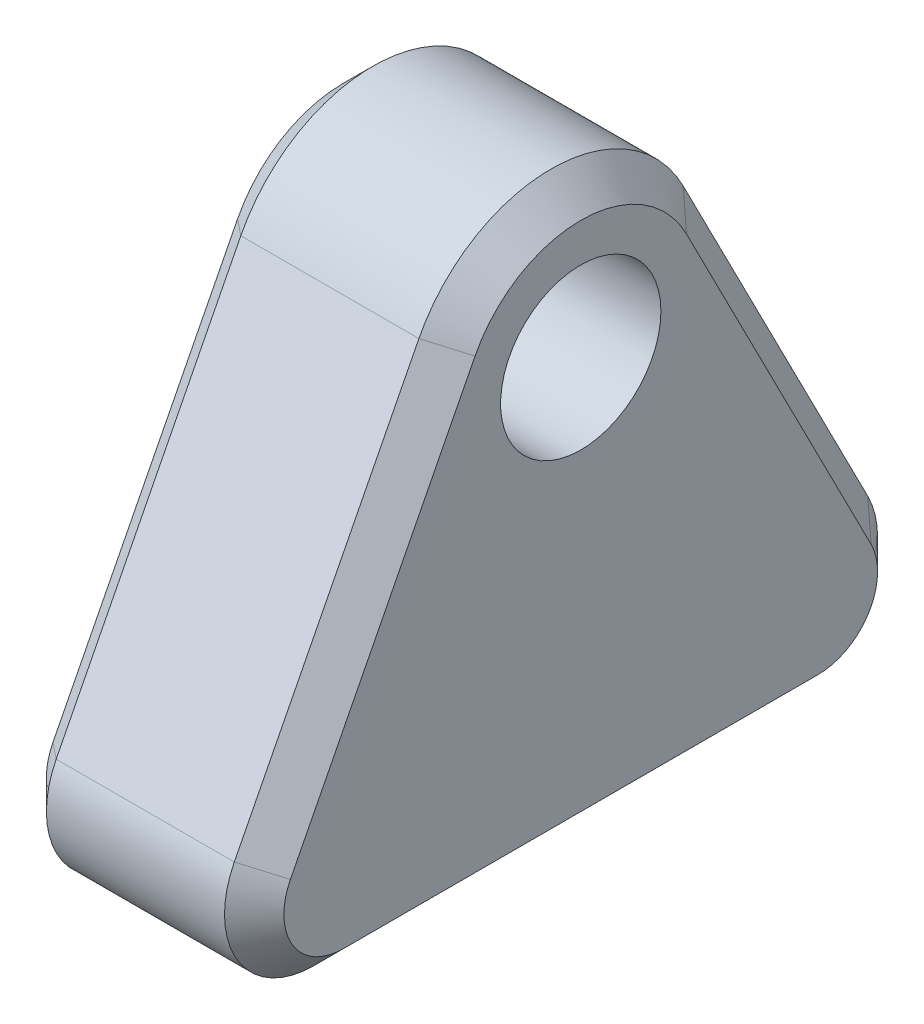
ISO-10303-21;
HEADER;
FILE_DESCRIPTION(('STEP AP214'),'2;1');
FILE_NAME('part.step','',(''),(''),'','','');
FILE_SCHEMA(('AUTOMOTIVE_DESIGN { 1 0 10303 214 1 1 1 1 }'));
ENDSEC;
DATA;
#1=APPLICATION_CONTEXT('core data for automotive mechanical design processes');
#2=APPLICATION_PROTOCOL_DEFINITION('international standard','automotive_design',2000,#1);
#3=PRODUCT_CONTEXT('',#1,'mechanical');
#4=PRODUCT('Part','Part','',(#3));
#5=PRODUCT_RELATED_PRODUCT_CATEGORY('part','',(#4));
#6=PRODUCT_DEFINITION_FORMATION('','',#4);
#7=PRODUCT_DEFINITION_CONTEXT('part definition',#1,'design');
#8=PRODUCT_DEFINITION('design','',#6,#7);
#9=PRODUCT_DEFINITION_SHAPE('','',#8);
#10=(LENGTH_UNIT() NAMED_UNIT(*) SI_UNIT(.MILLI.,.METRE.));
#11=(NAMED_UNIT(*) PLANE_ANGLE_UNIT() SI_UNIT($,.RADIAN.));
#12=(NAMED_UNIT(*) SI_UNIT($,.STERADIAN.) SOLID_ANGLE_UNIT());
#13=UNCERTAINTY_MEASURE_WITH_UNIT(LENGTH_MEASURE(1.E-05),#10,'distance_accuracy_value','');
#14=(GEOMETRIC_REPRESENTATION_CONTEXT(3) GLOBAL_UNCERTAINTY_ASSIGNED_CONTEXT((#13)) GLOBAL_UNIT_ASSIGNED_CONTEXT((#10,
#11,#12)) REPRESENTATION_CONTEXT('',''));
#15=CARTESIAN_POINT('',(0.,0.,0.));
#16=DIRECTION('',(0.,0.,1.));
#17=DIRECTION('',(1.,0.,0.));
#18=AXIS2_PLACEMENT_3D('',#15,#16,#17);
#19=CARTESIAN_POINT('',(4.,0.,0.));
#20=DIRECTION('',(1.,0.,0.));
#21=DIRECTION('',(0.,0.,-1.));
#22=AXIS2_PLACEMENT_3D('',#19,#20,#21);
#23=PLANE('',#22);
#24=DIRECTION('',(0.,0.,-1.));
#25=VECTOR('',#24,1.);
#26=CARTESIAN_POINT('',(4.,-13.25,-8.));
#27=LINE('',#26,#25);
#28=CARTESIAN_POINT('',(4.,-13.25,8.));
#29=VERTEX_POINT('',#28);
#30=CARTESIAN_POINT('',(4.,-13.25,-8.));
#31=VERTEX_POINT('',#30);
#32=EDGE_CURVE('E65',#29,#31,#27,.T.);
#33=ORIENTED_EDGE('',*,*,#32,.T.);
#34=CARTESIAN_POINT('',(4.,-11.25,-8.));
#35=DIRECTION('',(1.,0.,0.));
#36=DIRECTION('',(0.,0.,-1.));
#37=AXIS2_PLACEMENT_3D('',#34,#35,#36);
#38=CIRCLE('',#37,2.);
#39=CARTESIAN_POINT('',(4.,-10.3393244259791,-9.78063752596694));
#40=VERTEX_POINT('',#39);
#41=EDGE_CURVE('E191',#31,#40,#38,.T.);
#42=ORIENTED_EDGE('',*,*,#41,.T.);
#43=DIRECTION('',(0.,0.890318762983468,0.455337787010466));
#44=VECTOR('',#43,1.);
#45=CARTESIAN_POINT('',(4.,1.82135114804186,-3.56127505193387));
#46=LINE('',#45,#44);
#47=CARTESIAN_POINT('',(4.,1.82135114804186,-3.56127505193387));
#48=VERTEX_POINT('',#47);
#49=EDGE_CURVE('E164',#40,#48,#46,.T.);
#50=ORIENTED_EDGE('',*,*,#49,.T.);
#51=CARTESIAN_POINT('',(4.,0.,0.));
#52=DIRECTION('',(1.,0.,0.));
#53=DIRECTION('',(0.,0.,-1.));
#54=AXIS2_PLACEMENT_3D('',#51,#52,#53);
#55=CIRCLE('',#54,4.);
#56=CARTESIAN_POINT('',(4.,1.82135114804186,3.56127505193387));
#57=VERTEX_POINT('',#56);
#58=EDGE_CURVE('E265',#48,#57,#55,.T.);
#59=ORIENTED_EDGE('',*,*,#58,.T.);
#60=DIRECTION('',(0.,-0.890318762983468,0.455337787010466));
#61=VECTOR('',#60,1.);
#62=CARTESIAN_POINT('',(4.,-10.3393244259791,9.78063752596693));
#63=LINE('',#62,#61);
#64=CARTESIAN_POINT('',(4.,-10.3393244259791,9.78063752596693));
#65=VERTEX_POINT('',#64);
#66=EDGE_CURVE('E261',#57,#65,#63,.T.);
#67=ORIENTED_EDGE('',*,*,#66,.T.);
#68=CARTESIAN_POINT('',(4.,-11.25,8.));
#69=DIRECTION('',(1.,0.,0.));
#70=DIRECTION('',(0.,0.,-1.));
#71=AXIS2_PLACEMENT_3D('',#68,#69,#70);
#72=CIRCLE('',#71,2.);
#73=EDGE_CURVE('E263',#65,#29,#72,.T.);
#74=ORIENTED_EDGE('',*,*,#73,.T.);
#75=EDGE_LOOP('',(#33,#42,#50,#59,#67,#74));
#76=FACE_BOUND('',#75,.T.);
#77=CARTESIAN_POINT('',(4.,0.,0.));
#78=DIRECTION('',(1.,0.,0.));
#79=DIRECTION('',(0.,0.,-1.));
#80=AXIS2_PLACEMENT_3D('',#77,#78,#79);
#81=CIRCLE('',#80,2.7);
#82=CARTESIAN_POINT('',(4.,0.,-2.7));
#83=VERTEX_POINT('',#82);
#84=EDGE_CURVE('E215',#83,#83,#81,.T.);
#85=ORIENTED_EDGE('',*,*,#84,.F.);
#86=EDGE_LOOP('',(#85));
#87=FACE_BOUND('',#86,.T.);
#88=ADVANCED_FACE('F41',(#76,#87),#23,.T.);
#89=CARTESIAN_POINT('',(-4.,0.,0.));
#90=DIRECTION('',(1.,0.,0.));
#91=DIRECTION('',(0.,0.,-1.));
#92=AXIS2_PLACEMENT_3D('',#89,#90,#91);
#93=PLANE('',#92);
#94=DIRECTION('',(0.,-0.890318762983468,-0.455337787010466));
#95=VECTOR('',#94,1.);
#96=CARTESIAN_POINT('',(-4.,1.82135114804186,-3.56127505193387));
#97=LINE('',#96,#95);
#98=CARTESIAN_POINT('',(-4.,1.82135114804186,-3.56127505193387));
#99=VERTEX_POINT('',#98);
#100=CARTESIAN_POINT('',(-4.,-10.3393244259791,-9.78063752596694));
#101=VERTEX_POINT('',#100);
#102=EDGE_CURVE('E240',#99,#101,#97,.T.);
#103=ORIENTED_EDGE('',*,*,#102,.T.);
#104=CARTESIAN_POINT('',(-4.,-11.25,-8.));
#105=DIRECTION('',(1.,0.,0.));
#106=DIRECTION('',(0.,0.,-1.));
#107=AXIS2_PLACEMENT_3D('',#104,#105,#106);
#108=CIRCLE('',#107,2.);
#109=CARTESIAN_POINT('',(-4.,-13.25,-8.));
#110=VERTEX_POINT('',#109);
#111=EDGE_CURVE('E145',#101,#110,#108,.F.);
#112=ORIENTED_EDGE('',*,*,#111,.T.);
#113=DIRECTION('',(0.,0.,1.));
#114=VECTOR('',#113,1.);
#115=CARTESIAN_POINT('',(-4.,-13.25,0.));
#116=LINE('',#115,#114);
#117=CARTESIAN_POINT('',(-4.,-13.25,8.));
#118=VERTEX_POINT('',#117);
#119=EDGE_CURVE('E238',#110,#118,#116,.T.);
#120=ORIENTED_EDGE('',*,*,#119,.T.);
#121=CARTESIAN_POINT('',(-4.,-11.25,8.));
#122=DIRECTION('',(1.,0.,0.));
#123=DIRECTION('',(0.,0.,-1.));
#124=AXIS2_PLACEMENT_3D('',#121,#122,#123);
#125=CIRCLE('',#124,2.);
#126=CARTESIAN_POINT('',(-4.,-10.3393244259791,9.78063752596693));
#127=VERTEX_POINT('',#126);
#128=EDGE_CURVE('E234',#118,#127,#125,.F.);
#129=ORIENTED_EDGE('',*,*,#128,.T.);
#130=DIRECTION('',(0.,0.890318762983468,-0.455337787010466));
#131=VECTOR('',#130,1.);
#132=CARTESIAN_POINT('',(-4.,1.82135114804186,3.56127505193387));
#133=LINE('',#132,#131);
#134=CARTESIAN_POINT('',(-4.,1.82135114804186,3.56127505193387));
#135=VERTEX_POINT('',#134);
#136=EDGE_CURVE('E232',#127,#135,#133,.T.);
#137=ORIENTED_EDGE('',*,*,#136,.T.);
#138=CARTESIAN_POINT('',(-4.,0.,0.));
#139=DIRECTION('',(1.,0.,0.));
#140=DIRECTION('',(0.,0.,-1.));
#141=AXIS2_PLACEMENT_3D('',#138,#139,#140);
#142=CIRCLE('',#141,4.);
#143=EDGE_CURVE('E236',#135,#99,#142,.F.);
#144=ORIENTED_EDGE('',*,*,#143,.T.);
#145=EDGE_LOOP('',(#103,#112,#120,#129,#137,#144));
#146=FACE_BOUND('',#145,.T.);
#147=CARTESIAN_POINT('',(-4.,0.,0.));
#148=DIRECTION('',(1.,0.,0.));
#149=DIRECTION('',(0.,0.,-1.));
#150=AXIS2_PLACEMENT_3D('',#147,#148,#149);
#151=CIRCLE('',#150,2.7);
#152=CARTESIAN_POINT('',(-4.,0.,-2.7));
#153=VERTEX_POINT('',#152);
#154=EDGE_CURVE('E218',#153,#153,#151,.T.);
#155=ORIENTED_EDGE('',*,*,#154,.T.);
#156=EDGE_LOOP('',(#155));
#157=FACE_BOUND('',#156,.T.);
#158=ADVANCED_FACE('F296',(#146,#157),#93,.F.);
#159=CARTESIAN_POINT('',(4.,0.,0.));
#160=DIRECTION('',(-1.,0.,0.));
#161=DIRECTION('',(0.,0.,1.));
#162=AXIS2_PLACEMENT_3D('',#159,#160,#161);
#163=CYLINDRICAL_SURFACE('',#162,5.);
#164=DIRECTION('',(-1.,0.,0.));
#165=VECTOR('',#164,1.);
#166=CARTESIAN_POINT('',(4.,2.27668893505233,-4.45159381491734));
#167=LINE('',#166,#165);
#168=CARTESIAN_POINT('',(3.,2.27668893505233,-4.45159381491734));
#169=VERTEX_POINT('',#168);
#170=CARTESIAN_POINT('',(-3.,2.27668893505233,-4.45159381491734));
#171=VERTEX_POINT('',#170);
#172=EDGE_CURVE('E140',#169,#171,#167,.T.);
#173=ORIENTED_EDGE('',*,*,#172,.T.);
#174=CARTESIAN_POINT('',(-3.,0.,0.));
#175=DIRECTION('',(1.,0.,0.));
#176=DIRECTION('',(0.,0.,-1.));
#177=AXIS2_PLACEMENT_3D('',#174,#175,#176);
#178=CIRCLE('',#177,5.);
#179=CARTESIAN_POINT('',(-3.,2.27668893505233,4.45159381491734));
#180=VERTEX_POINT('',#179);
#181=EDGE_CURVE('E251',#171,#180,#178,.T.);
#182=ORIENTED_EDGE('',*,*,#181,.T.);
#183=DIRECTION('',(-1.,0.,0.));
#184=VECTOR('',#183,1.);
#185=CARTESIAN_POINT('',(4.,2.27668893505233,4.45159381491734));
#186=LINE('',#185,#184);
#187=CARTESIAN_POINT('',(3.,2.27668893505233,4.45159381491734));
#188=VERTEX_POINT('',#187);
#189=EDGE_CURVE('E161',#188,#180,#186,.T.);
#190=ORIENTED_EDGE('',*,*,#189,.F.);
#191=CARTESIAN_POINT('',(3.,0.,0.));
#192=DIRECTION('',(1.,0.,0.));
#193=DIRECTION('',(0.,0.,-1.));
#194=AXIS2_PLACEMENT_3D('',#191,#192,#193);
#195=CIRCLE('',#194,5.);
#196=EDGE_CURVE('E249',#188,#169,#195,.F.);
#197=ORIENTED_EDGE('',*,*,#196,.T.);
#198=EDGE_LOOP('',(#173,#182,#190,#197));
#199=FACE_BOUND('',#198,.T.);
#200=ADVANCED_FACE('F332',(#199),#163,.T.);
#201=CARTESIAN_POINT('',(4.,2.27668893505233,4.45159381491734));
#202=DIRECTION('',(0.,-0.455337787010466,-0.890318762983468));
#203=DIRECTION('',(0.,0.890318762983468,-0.455337787010466));
#204=AXIS2_PLACEMENT_3D('',#201,#202,#203);
#205=PLANE('',#204);
#206=ORIENTED_EDGE('',*,*,#189,.T.);
#207=DIRECTION('',(0.,-0.890318762983468,0.455337787010466));
#208=VECTOR('',#207,1.);
#209=CARTESIAN_POINT('',(-3.,2.27668893505233,4.45159381491734));
#210=LINE('',#209,#208);
#211=CARTESIAN_POINT('',(-3.,-9.8839866389686,10.6709562889504));
#212=VERTEX_POINT('',#211);
#213=EDGE_CURVE('E259',#180,#212,#210,.T.);
#214=ORIENTED_EDGE('',*,*,#213,.T.);
#215=DIRECTION('',(-1.,0.,0.));
#216=VECTOR('',#215,1.);
#217=CARTESIAN_POINT('',(4.,-9.8839866389686,10.6709562889504));
#218=LINE('',#217,#216);
#219=CARTESIAN_POINT('',(3.,-9.8839866389686,10.6709562889504));
#220=VERTEX_POINT('',#219);
#221=EDGE_CURVE('E226',#220,#212,#218,.T.);
#222=ORIENTED_EDGE('',*,*,#221,.F.);
#223=DIRECTION('',(0.,0.890318762983468,-0.455337787010466));
#224=VECTOR('',#223,1.);
#225=CARTESIAN_POINT('',(3.,2.27668893505233,4.45159381491734));
#226=LINE('',#225,#224);
#227=EDGE_CURVE('E257',#220,#188,#226,.T.);
#228=ORIENTED_EDGE('',*,*,#227,.T.);
#229=EDGE_LOOP('',(#206,#214,#222,#228));
#230=FACE_BOUND('',#229,.T.);
#231=ADVANCED_FACE('F330',(#230),#205,.F.);
#232=CARTESIAN_POINT('',(4.,-11.25,8.));
#233=DIRECTION('',(-1.,0.,0.));
#234=DIRECTION('',(0.,0.,1.));
#235=AXIS2_PLACEMENT_3D('',#232,#233,#234);
#236=CYLINDRICAL_SURFACE('',#235,3.);
#237=ORIENTED_EDGE('',*,*,#221,.T.);
#238=CARTESIAN_POINT('',(-3.,-11.25,8.));
#239=DIRECTION('',(1.,0.,0.));
#240=DIRECTION('',(0.,0.,-1.));
#241=AXIS2_PLACEMENT_3D('',#238,#239,#240);
#242=CIRCLE('',#241,3.);
#243=CARTESIAN_POINT('',(-3.,-14.25,8.));
#244=VERTEX_POINT('',#243);
#245=EDGE_CURVE('E255',#212,#244,#242,.T.);
#246=ORIENTED_EDGE('',*,*,#245,.T.);
#247=DIRECTION('',(-1.,0.,0.));
#248=VECTOR('',#247,1.);
#249=CARTESIAN_POINT('',(4.,-14.25,8.));
#250=LINE('',#249,#248);
#251=CARTESIAN_POINT('',(3.,-14.25,8.));
#252=VERTEX_POINT('',#251);
#253=EDGE_CURVE('E223',#252,#244,#250,.T.);
#254=ORIENTED_EDGE('',*,*,#253,.F.);
#255=CARTESIAN_POINT('',(3.,-11.25,8.));
#256=DIRECTION('',(1.,0.,0.));
#257=DIRECTION('',(0.,0.,-1.));
#258=AXIS2_PLACEMENT_3D('',#255,#256,#257);
#259=CIRCLE('',#258,3.);
#260=EDGE_CURVE('E253',#252,#220,#259,.F.);
#261=ORIENTED_EDGE('',*,*,#260,.T.);
#262=EDGE_LOOP('',(#237,#246,#254,#261));
#263=FACE_BOUND('',#262,.T.);
#264=ADVANCED_FACE('F309',(#263),#236,.T.);
#265=CARTESIAN_POINT('',(4.,-14.25,8.));
#266=DIRECTION('',(0.,1.,0.));
#267=DIRECTION('',(0.,0.,1.));
#268=AXIS2_PLACEMENT_3D('',#265,#266,#267);
#269=PLANE('',#268);
#270=CARTESIAN_POINT('',(0.,-14.25,-5.));
#271=DIRECTION('',(0.,1.,0.));
#272=DIRECTION('',(0.,0.,1.));
#273=AXIS2_PLACEMENT_3D('',#270,#271,#272);
#274=CIRCLE('',#273,2.9);
#275=CARTESIAN_POINT('',(0.,-14.25,-2.1));
#276=VERTEX_POINT('',#275);
#277=EDGE_CURVE('E50',#276,#276,#274,.T.);
#278=ORIENTED_EDGE('',*,*,#277,.T.);
#279=EDGE_LOOP('',(#278));
#280=FACE_BOUND('',#279,.T.);
#281=CARTESIAN_POINT('',(0.,-14.25,5.));
#282=DIRECTION('',(0.,1.,0.));
#283=DIRECTION('',(0.,0.,1.));
#284=AXIS2_PLACEMENT_3D('',#281,#282,#283);
#285=CIRCLE('',#284,2.9);
#286=CARTESIAN_POINT('',(0.,-14.25,7.9));
#287=VERTEX_POINT('',#286);
#288=EDGE_CURVE('E190',#287,#287,#285,.T.);
#289=ORIENTED_EDGE('',*,*,#288,.T.);
#290=EDGE_LOOP('',(#289));
#291=FACE_BOUND('',#290,.T.);
#292=ORIENTED_EDGE('',*,*,#253,.T.);
#293=DIRECTION('',(0.,0.,-1.));
#294=VECTOR('',#293,1.);
#295=CARTESIAN_POINT('',(-3.,-14.25,8.));
#296=LINE('',#295,#294);
#297=CARTESIAN_POINT('',(-3.,-14.25,-8.));
#298=VERTEX_POINT('',#297);
#299=EDGE_CURVE('E247',#244,#298,#296,.T.);
#300=ORIENTED_EDGE('',*,*,#299,.T.);
#301=DIRECTION('',(-1.,0.,0.));
#302=VECTOR('',#301,1.);
#303=CARTESIAN_POINT('',(4.,-14.25,-8.));
#304=LINE('',#303,#302);
#305=CARTESIAN_POINT('',(3.,-14.25,-8.));
#306=VERTEX_POINT('',#305);
#307=EDGE_CURVE('E156',#306,#298,#304,.T.);
#308=ORIENTED_EDGE('',*,*,#307,.F.);
#309=DIRECTION('',(0.,0.,1.));
#310=VECTOR('',#309,1.);
#311=CARTESIAN_POINT('',(3.,-14.25,8.));
#312=LINE('',#311,#310);
#313=EDGE_CURVE('E245',#306,#252,#312,.T.);
#314=ORIENTED_EDGE('',*,*,#313,.T.);
#315=EDGE_LOOP('',(#292,#300,#308,#314));
#316=FACE_BOUND('',#315,.T.);
#317=ADVANCED_FACE('F196',(#280,#291,#316),#269,.F.);
#318=CARTESIAN_POINT('',(4.,-11.25,-8.));
#319=DIRECTION('',(-1.,0.,0.));
#320=DIRECTION('',(0.,0.,1.));
#321=AXIS2_PLACEMENT_3D('',#318,#319,#320);
#322=CYLINDRICAL_SURFACE('',#321,3.);
#323=ORIENTED_EDGE('',*,*,#307,.T.);
#324=CARTESIAN_POINT('',(-3.,-11.25,-8.));
#325=DIRECTION('',(1.,0.,0.));
#326=DIRECTION('',(0.,0.,-1.));
#327=AXIS2_PLACEMENT_3D('',#324,#325,#326);
#328=CIRCLE('',#327,3.);
#329=CARTESIAN_POINT('',(-3.,-9.8839866389686,-10.6709562889504));
#330=VERTEX_POINT('',#329);
#331=EDGE_CURVE('E155',#298,#330,#328,.T.);
#332=ORIENTED_EDGE('',*,*,#331,.T.);
#333=DIRECTION('',(-1.,0.,0.));
#334=VECTOR('',#333,1.);
#335=CARTESIAN_POINT('',(4.,-9.8839866389686,-10.6709562889504));
#336=LINE('',#335,#334);
#337=CARTESIAN_POINT('',(3.,-9.8839866389686,-10.6709562889504));
#338=VERTEX_POINT('',#337);
#339=EDGE_CURVE('E138',#338,#330,#336,.T.);
#340=ORIENTED_EDGE('',*,*,#339,.F.);
#341=CARTESIAN_POINT('',(3.,-11.25,-8.));
#342=DIRECTION('',(1.,0.,0.));
#343=DIRECTION('',(0.,0.,-1.));
#344=AXIS2_PLACEMENT_3D('',#341,#342,#343);
#345=CIRCLE('',#344,3.);
#346=EDGE_CURVE('E152',#338,#306,#345,.F.);
#347=ORIENTED_EDGE('',*,*,#346,.T.);
#348=EDGE_LOOP('',(#323,#332,#340,#347));
#349=FACE_BOUND('',#348,.T.);
#350=ADVANCED_FACE('F151',(#349),#322,.T.);
#351=CARTESIAN_POINT('',(4.,-9.8839866389686,-10.6709562889504));
#352=DIRECTION('',(0.,-0.455337787010466,0.890318762983467));
#353=DIRECTION('',(0.,-0.890318762983467,-0.455337787010466));
#354=AXIS2_PLACEMENT_3D('',#351,#352,#353);
#355=PLANE('',#354);
#356=ORIENTED_EDGE('',*,*,#339,.T.);
#357=DIRECTION('',(0.,0.890318762983467,0.455337787010466));
#358=VECTOR('',#357,1.);
#359=CARTESIAN_POINT('',(-3.,-9.8839866389686,-10.6709562889504));
#360=LINE('',#359,#358);
#361=EDGE_CURVE('E144',#330,#171,#360,.T.);
#362=ORIENTED_EDGE('',*,*,#361,.T.);
#363=ORIENTED_EDGE('',*,*,#172,.F.);
#364=DIRECTION('',(0.,-0.890318762983467,-0.455337787010466));
#365=VECTOR('',#364,1.);
#366=CARTESIAN_POINT('',(3.,-9.8839866389686,-10.6709562889504));
#367=LINE('',#366,#365);
#368=EDGE_CURVE('E135',#169,#338,#367,.T.);
#369=ORIENTED_EDGE('',*,*,#368,.T.);
#370=EDGE_LOOP('',(#356,#362,#363,#369));
#371=FACE_BOUND('',#370,.T.);
#372=ADVANCED_FACE('F137',(#371),#355,.F.);
#373=CARTESIAN_POINT('',(4.,0.,0.));
#374=DIRECTION('',(-1.,0.,0.));
#375=DIRECTION('',(0.,0.,1.));
#376=AXIS2_PLACEMENT_3D('',#373,#374,#375);
#377=CYLINDRICAL_SURFACE('',#376,2.7);
#378=ORIENTED_EDGE('',*,*,#84,.T.);
#379=EDGE_LOOP('',(#378));
#380=FACE_BOUND('',#379,.T.);
#381=ORIENTED_EDGE('',*,*,#154,.F.);
#382=EDGE_LOOP('',(#381));
#383=FACE_BOUND('',#382,.T.);
#384=ADVANCED_FACE('F358',(#380,#383),#377,.F.);
#385=CARTESIAN_POINT('',(-3.,2.27668893505233,4.45159381491734));
#386=DIRECTION('',(0.707106781186548,-0.321972436925576,-0.629550434723228));
#387=DIRECTION('',(0.,-0.890318762983468,0.455337787010466));
#388=AXIS2_PLACEMENT_3D('',#385,#386,#387);
#389=PLANE('',#388);
#390=DIRECTION('',(0.707106781186547,0.321972436925576,0.629550434723229));
#391=VECTOR('',#390,1.);
#392=CARTESIAN_POINT('',(-4.,1.82135114804186,3.56127505193387));
#393=LINE('',#392,#391);
#394=EDGE_CURVE('E278',#135,#180,#393,.T.);
#395=ORIENTED_EDGE('',*,*,#394,.F.);
#396=ORIENTED_EDGE('',*,*,#136,.F.);
#397=DIRECTION('',(-0.707106781186547,-0.321972436925576,-0.629550434723229));
#398=VECTOR('',#397,1.);
#399=CARTESIAN_POINT('',(-3.,-9.8839866389686,10.6709562889504));
#400=LINE('',#399,#398);
#401=EDGE_CURVE('E173',#212,#127,#400,.T.);
#402=ORIENTED_EDGE('',*,*,#401,.F.);
#403=ORIENTED_EDGE('',*,*,#213,.F.);
#404=EDGE_LOOP('',(#395,#396,#402,#403));
#405=FACE_BOUND('',#404,.T.);
#406=ADVANCED_FACE('F294',(#405),#389,.F.);
#407=CARTESIAN_POINT('',(-3.,-11.25,8.));
#408=DIRECTION('',(1.,0.,0.));
#409=DIRECTION('',(0.,0.,-1.));
#410=AXIS2_PLACEMENT_3D('',#407,#408,#409);
#411=CONICAL_SURFACE('',#410,3.,0.785398163397449);
#412=ORIENTED_EDGE('',*,*,#401,.T.);
#413=ORIENTED_EDGE('',*,*,#128,.F.);
#414=DIRECTION('',(-0.707106781186547,0.707106781186548,0.));
#415=VECTOR('',#414,1.);
#416=CARTESIAN_POINT('',(-3.,-14.25,8.));
#417=LINE('',#416,#415);
#418=EDGE_CURVE('E276',#244,#118,#417,.T.);
#419=ORIENTED_EDGE('',*,*,#418,.F.);
#420=ORIENTED_EDGE('',*,*,#245,.F.);
#421=EDGE_LOOP('',(#412,#413,#419,#420));
#422=FACE_BOUND('',#421,.T.);
#423=ADVANCED_FACE('F289',(#422),#411,.T.);
#424=CARTESIAN_POINT('',(-3.,0.,0.));
#425=DIRECTION('',(1.,0.,0.));
#426=DIRECTION('',(0.,0.,-1.));
#427=AXIS2_PLACEMENT_3D('',#424,#425,#426);
#428=CONICAL_SURFACE('',#427,5.,0.785398163397449);
#429=ORIENTED_EDGE('',*,*,#394,.T.);
#430=ORIENTED_EDGE('',*,*,#181,.F.);
#431=DIRECTION('',(0.707106781186547,0.321972436925576,-0.629550434723229));
#432=VECTOR('',#431,1.);
#433=CARTESIAN_POINT('',(-4.,1.82135114804186,-3.56127505193387));
#434=LINE('',#433,#432);
#435=EDGE_CURVE('E273',#99,#171,#434,.T.);
#436=ORIENTED_EDGE('',*,*,#435,.F.);
#437=ORIENTED_EDGE('',*,*,#143,.F.);
#438=EDGE_LOOP('',(#429,#430,#436,#437));
#439=FACE_BOUND('',#438,.T.);
#440=ADVANCED_FACE('F333',(#439),#428,.T.);
#441=CARTESIAN_POINT('',(-3.,-14.25,8.));
#442=DIRECTION('',(0.707106781186548,0.707106781186547,0.));
#443=DIRECTION('',(0.,0.,-1.));
#444=AXIS2_PLACEMENT_3D('',#441,#442,#443);
#445=PLANE('',#444);
#446=ORIENTED_EDGE('',*,*,#418,.T.);
#447=ORIENTED_EDGE('',*,*,#119,.F.);
#448=DIRECTION('',(-0.707106781186548,0.707106781186548,0.));
#449=VECTOR('',#448,1.);
#450=CARTESIAN_POINT('',(-3.,-14.25,-8.));
#451=LINE('',#450,#449);
#452=EDGE_CURVE('E271',#298,#110,#451,.T.);
#453=ORIENTED_EDGE('',*,*,#452,.F.);
#454=ORIENTED_EDGE('',*,*,#299,.F.);
#455=EDGE_LOOP('',(#446,#447,#453,#454));
#456=FACE_BOUND('',#455,.T.);
#457=ADVANCED_FACE('F303',(#456),#445,.F.);
#458=CARTESIAN_POINT('',(-3.,-9.8839866389686,-10.6709562889504));
#459=DIRECTION('',(0.707106781186548,-0.321972436925576,0.629550434723228));
#460=DIRECTION('',(0.,0.890318762983467,0.455337787010466));
#461=AXIS2_PLACEMENT_3D('',#458,#459,#460);
#462=PLANE('',#461);
#463=ORIENTED_EDGE('',*,*,#435,.T.);
#464=ORIENTED_EDGE('',*,*,#361,.F.);
#465=DIRECTION('',(0.707106781186547,0.321972436925577,-0.629550434723229));
#466=VECTOR('',#465,1.);
#467=CARTESIAN_POINT('',(-4.,-10.3393244259791,-9.78063752596694));
#468=LINE('',#467,#466);
#469=EDGE_CURVE('E186',#101,#330,#468,.T.);
#470=ORIENTED_EDGE('',*,*,#469,.F.);
#471=ORIENTED_EDGE('',*,*,#102,.F.);
#472=EDGE_LOOP('',(#463,#464,#470,#471));
#473=FACE_BOUND('',#472,.T.);
#474=ADVANCED_FACE('F337',(#473),#462,.F.);
#475=CARTESIAN_POINT('',(-3.,-11.25,-8.));
#476=DIRECTION('',(1.,0.,0.));
#477=DIRECTION('',(0.,0.,-1.));
#478=AXIS2_PLACEMENT_3D('',#475,#476,#477);
#479=CONICAL_SURFACE('',#478,3.,0.785398163397449);
#480=ORIENTED_EDGE('',*,*,#452,.T.);
#481=ORIENTED_EDGE('',*,*,#111,.F.);
#482=ORIENTED_EDGE('',*,*,#469,.T.);
#483=ORIENTED_EDGE('',*,*,#331,.F.);
#484=EDGE_LOOP('',(#480,#481,#482,#483));
#485=FACE_BOUND('',#484,.T.);
#486=ADVANCED_FACE('F340',(#485),#479,.T.);
#487=CARTESIAN_POINT('',(4.,1.82135114804186,3.56127505193387));
#488=DIRECTION('',(0.707106781186545,0.321972436925577,0.62955043472323));
#489=DIRECTION('',(0.,0.890318762983468,-0.455337787010466));
#490=AXIS2_PLACEMENT_3D('',#487,#488,#489);
#491=PLANE('',#490);
#492=DIRECTION('',(0.70710678118655,-0.321972436925575,-0.629550434723227));
#493=VECTOR('',#492,1.);
#494=CARTESIAN_POINT('',(3.,2.27668893505233,4.45159381491734));
#495=LINE('',#494,#493);
#496=EDGE_CURVE('E180',#188,#57,#495,.T.);
#497=ORIENTED_EDGE('',*,*,#496,.F.);
#498=ORIENTED_EDGE('',*,*,#227,.F.);
#499=DIRECTION('',(-0.707106781186549,0.321972436925576,0.629550434723227));
#500=VECTOR('',#499,1.);
#501=CARTESIAN_POINT('',(4.,-10.3393244259791,9.78063752596693));
#502=LINE('',#501,#500);
#503=EDGE_CURVE('E183',#65,#220,#502,.T.);
#504=ORIENTED_EDGE('',*,*,#503,.F.);
#505=ORIENTED_EDGE('',*,*,#66,.F.);
#506=EDGE_LOOP('',(#497,#498,#504,#505));
#507=FACE_BOUND('',#506,.T.);
#508=ADVANCED_FACE('F327',(#507),#491,.T.);
#509=CARTESIAN_POINT('',(4.,-11.25,8.));
#510=DIRECTION('',(-1.,0.,0.));
#511=DIRECTION('',(0.,0.,1.));
#512=AXIS2_PLACEMENT_3D('',#509,#510,#511);
#513=CONICAL_SURFACE('',#512,2.,0.785398163397446);
#514=ORIENTED_EDGE('',*,*,#503,.T.);
#515=ORIENTED_EDGE('',*,*,#260,.F.);
#516=DIRECTION('',(-0.707106781186549,-0.707106781186546,0.));
#517=VECTOR('',#516,1.);
#518=CARTESIAN_POINT('',(4.,-13.25,8.));
#519=LINE('',#518,#517);
#520=EDGE_CURVE('E177',#29,#252,#519,.T.);
#521=ORIENTED_EDGE('',*,*,#520,.F.);
#522=ORIENTED_EDGE('',*,*,#73,.F.);
#523=EDGE_LOOP('',(#514,#515,#521,#522));
#524=FACE_BOUND('',#523,.T.);
#525=ADVANCED_FACE('F313',(#524),#513,.T.);
#526=CARTESIAN_POINT('',(4.,0.,0.));
#527=DIRECTION('',(-1.,0.,0.));
#528=DIRECTION('',(0.,0.,1.));
#529=AXIS2_PLACEMENT_3D('',#526,#527,#528);
#530=CONICAL_SURFACE('',#529,4.,0.785398163397445);
#531=ORIENTED_EDGE('',*,*,#496,.T.);
#532=ORIENTED_EDGE('',*,*,#58,.F.);
#533=DIRECTION('',(0.70710678118655,-0.321972436925575,0.629550434723227));
#534=VECTOR('',#533,1.);
#535=CARTESIAN_POINT('',(3.,2.27668893505233,-4.45159381491734));
#536=LINE('',#535,#534);
#537=EDGE_CURVE('E167',#169,#48,#536,.T.);
#538=ORIENTED_EDGE('',*,*,#537,.F.);
#539=ORIENTED_EDGE('',*,*,#196,.F.);
#540=EDGE_LOOP('',(#531,#532,#538,#539));
#541=FACE_BOUND('',#540,.T.);
#542=ADVANCED_FACE('F322',(#541),#530,.T.);
#543=CARTESIAN_POINT('',(4.,-13.25,0.));
#544=DIRECTION('',(0.707106781186545,-0.70710678118655,0.));
#545=DIRECTION('',(0.,0.,1.));
#546=AXIS2_PLACEMENT_3D('',#543,#544,#545);
#547=PLANE('',#546);
#548=ORIENTED_EDGE('',*,*,#520,.T.);
#549=ORIENTED_EDGE('',*,*,#313,.F.);
#550=DIRECTION('',(-0.70710678118655,-0.707106781186545,0.));
#551=VECTOR('',#550,1.);
#552=CARTESIAN_POINT('',(4.,-13.25,-8.));
#553=LINE('',#552,#551);
#554=EDGE_CURVE('E159',#31,#306,#553,.T.);
#555=ORIENTED_EDGE('',*,*,#554,.F.);
#556=ORIENTED_EDGE('',*,*,#32,.F.);
#557=EDGE_LOOP('',(#548,#549,#555,#556));
#558=FACE_BOUND('',#557,.T.);
#559=ADVANCED_FACE('F317',(#558),#547,.T.);
#560=CARTESIAN_POINT('',(4.,1.82135114804186,-3.56127505193387));
#561=DIRECTION('',(0.707106781186546,0.321972436925577,-0.62955043472323));
#562=DIRECTION('',(0.,-0.890318762983467,-0.455337787010466));
#563=AXIS2_PLACEMENT_3D('',#560,#561,#562);
#564=PLANE('',#563);
#565=ORIENTED_EDGE('',*,*,#537,.T.);
#566=ORIENTED_EDGE('',*,*,#49,.F.);
#567=DIRECTION('',(0.707106781186549,-0.321972436925576,0.629550434723226));
#568=VECTOR('',#567,1.);
#569=CARTESIAN_POINT('',(3.,-9.8839866389686,-10.6709562889504));
#570=LINE('',#569,#568);
#571=EDGE_CURVE('E57',#338,#40,#570,.T.);
#572=ORIENTED_EDGE('',*,*,#571,.F.);
#573=ORIENTED_EDGE('',*,*,#368,.F.);
#574=EDGE_LOOP('',(#565,#566,#572,#573));
#575=FACE_BOUND('',#574,.T.);
#576=ADVANCED_FACE('F163',(#575),#564,.T.);
#577=CARTESIAN_POINT('',(4.,-11.25,-8.));
#578=DIRECTION('',(-1.,0.,0.));
#579=DIRECTION('',(0.,0.,1.));
#580=AXIS2_PLACEMENT_3D('',#577,#578,#579);
#581=CONICAL_SURFACE('',#580,2.,0.785398163397445);
#582=ORIENTED_EDGE('',*,*,#554,.T.);
#583=ORIENTED_EDGE('',*,*,#346,.F.);
#584=ORIENTED_EDGE('',*,*,#571,.T.);
#585=ORIENTED_EDGE('',*,*,#41,.F.);
#586=EDGE_LOOP('',(#582,#583,#584,#585));
#587=FACE_BOUND('',#586,.T.);
#588=ADVANCED_FACE('F158',(#587),#581,.T.);
#589=CARTESIAN_POINT('',(0.,-7.25,-5.));
#590=DIRECTION('',(0.,-1.,0.));
#591=DIRECTION('',(0.,0.,-1.));
#592=AXIS2_PLACEMENT_3D('',#589,#590,#591);
#593=CYLINDRICAL_SURFACE('',#592,2.4);
#594=CARTESIAN_POINT('',(0.,-13.75,-5.));
#595=DIRECTION('',(0.,1.,0.));
#596=DIRECTION('',(0.,0.,1.));
#597=AXIS2_PLACEMENT_3D('',#594,#595,#596);
#598=CIRCLE('',#597,2.4);
#599=CARTESIAN_POINT('',(0.,-13.75,-2.6));
#600=VERTEX_POINT('',#599);
#601=EDGE_CURVE('E187',#600,#600,#598,.F.);
#602=ORIENTED_EDGE('',*,*,#601,.T.);
#603=EDGE_LOOP('',(#602));
#604=FACE_BOUND('',#603,.T.);
#605=CARTESIAN_POINT('',(0.,-7.25,-5.));
#606=DIRECTION('',(0.,-1.,0.));
#607=DIRECTION('',(0.,0.,-1.));
#608=AXIS2_PLACEMENT_3D('',#605,#606,#607);
#609=CIRCLE('',#608,2.4);
#610=CARTESIAN_POINT('',(0.,-7.25,-7.4));
#611=VERTEX_POINT('',#610);
#612=EDGE_CURVE('E170',#611,#611,#609,.T.);
#613=ORIENTED_EDGE('',*,*,#612,.F.);
#614=EDGE_LOOP('',(#613));
#615=FACE_BOUND('',#614,.T.);
#616=ADVANCED_FACE('F205',(#604,#615),#593,.F.);
#617=CARTESIAN_POINT('',(0.,-7.25,-5.));
#618=DIRECTION('',(0.,-1.,0.));
#619=DIRECTION('',(0.,0.,-1.));
#620=AXIS2_PLACEMENT_3D('',#617,#618,#619);
#621=PLANE('',#620);
#622=ORIENTED_EDGE('',*,*,#612,.T.);
#623=EDGE_LOOP('',(#622));
#624=FACE_BOUND('',#623,.T.);
#625=ADVANCED_FACE('F208',(#624),#621,.T.);
#626=CARTESIAN_POINT('',(0.,-7.25,5.));
#627=DIRECTION('',(0.,-1.,0.));
#628=DIRECTION('',(0.,0.,-1.));
#629=AXIS2_PLACEMENT_3D('',#626,#627,#628);
#630=CYLINDRICAL_SURFACE('',#629,2.4);
#631=CARTESIAN_POINT('',(0.,-13.75,5.));
#632=DIRECTION('',(0.,1.,0.));
#633=DIRECTION('',(0.,0.,1.));
#634=AXIS2_PLACEMENT_3D('',#631,#632,#633);
#635=CIRCLE('',#634,2.4);
#636=CARTESIAN_POINT('',(0.,-13.75,7.4));
#637=VERTEX_POINT('',#636);
#638=EDGE_CURVE('E11',#637,#637,#635,.F.);
#639=ORIENTED_EDGE('',*,*,#638,.T.);
#640=EDGE_LOOP('',(#639));
#641=FACE_BOUND('',#640,.T.);
#642=CARTESIAN_POINT('',(0.,-7.25,5.));
#643=DIRECTION('',(0.,-1.,0.));
#644=DIRECTION('',(0.,0.,-1.));
#645=AXIS2_PLACEMENT_3D('',#642,#643,#644);
#646=CIRCLE('',#645,2.4);
#647=CARTESIAN_POINT('',(0.,-7.25,2.6));
#648=VERTEX_POINT('',#647);
#649=EDGE_CURVE('E165',#648,#648,#646,.T.);
#650=ORIENTED_EDGE('',*,*,#649,.F.);
#651=EDGE_LOOP('',(#650));
#652=FACE_BOUND('',#651,.T.);
#653=ADVANCED_FACE('F489',(#641,#652),#630,.F.);
#654=CARTESIAN_POINT('',(0.,-7.25,5.));
#655=DIRECTION('',(0.,-1.,0.));
#656=DIRECTION('',(0.,0.,-1.));
#657=AXIS2_PLACEMENT_3D('',#654,#655,#656);
#658=PLANE('',#657);
#659=ORIENTED_EDGE('',*,*,#649,.T.);
#660=EDGE_LOOP('',(#659));
#661=FACE_BOUND('',#660,.T.);
#662=ADVANCED_FACE('F202',(#661),#658,.T.);
#663=CARTESIAN_POINT('',(0.,-13.75,-5.));
#664=DIRECTION('',(0.,-1.,0.));
#665=DIRECTION('',(0.,0.,-1.));
#666=AXIS2_PLACEMENT_3D('',#663,#664,#665);
#667=CONICAL_SURFACE('',#666,2.4,0.785398163397451);
#668=ORIENTED_EDGE('',*,*,#277,.F.);
#669=EDGE_LOOP('',(#668));
#670=FACE_BOUND('',#669,.T.);
#671=ORIENTED_EDGE('',*,*,#601,.F.);
#672=EDGE_LOOP('',(#671));
#673=FACE_BOUND('',#672,.T.);
#674=ADVANCED_FACE('F199',(#670,#673),#667,.F.);
#675=CARTESIAN_POINT('',(0.,-13.75,5.));
#676=DIRECTION('',(0.,-1.,0.));
#677=DIRECTION('',(0.,0.,-1.));
#678=AXIS2_PLACEMENT_3D('',#675,#676,#677);
#679=CONICAL_SURFACE('',#678,2.4,0.785398163397447);
#680=ORIENTED_EDGE('',*,*,#288,.F.);
#681=EDGE_LOOP('',(#680));
#682=FACE_BOUND('',#681,.T.);
#683=ORIENTED_EDGE('',*,*,#638,.F.);
#684=EDGE_LOOP('',(#683));
#685=FACE_BOUND('',#684,.T.);
#686=ADVANCED_FACE('F44',(#682,#685),#679,.F.);
#687=CLOSED_SHELL('',(#88,#158,#200,#231,#264,#317,#350,#372,#384,#406,#423,#440,#457,#474,#486,
#508,#525,#542,#559,#576,#588,#616,#625,#653,#662,#674,#686));
#688=MANIFOLD_SOLID_BREP('B2',#687);
#689=ADVANCED_BREP_SHAPE_REPRESENTATION('',(#18,#688),#14);
#690=SHAPE_DEFINITION_REPRESENTATION(#9,#689);
ENDSEC;
END-ISO-10303-21;
